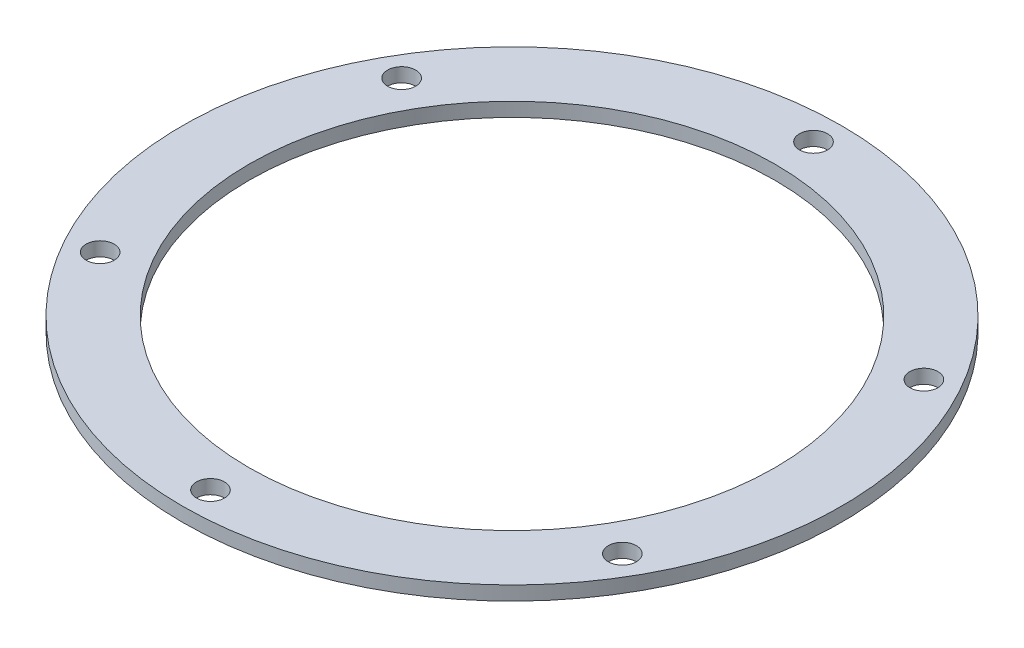
ISO-10303-21;
HEADER;
FILE_DESCRIPTION(('STEP AP214'),'2;1');
FILE_NAME('part.step','',(''),(''),'','','');
FILE_SCHEMA(('AUTOMOTIVE_DESIGN { 1 0 10303 214 1 1 1 1 }'));
ENDSEC;
DATA;
#1=APPLICATION_CONTEXT('core data for automotive mechanical design processes');
#2=APPLICATION_PROTOCOL_DEFINITION('international standard','automotive_design',2000,#1);
#3=PRODUCT_CONTEXT('',#1,'mechanical');
#4=PRODUCT('Part','Part','',(#3));
#5=PRODUCT_RELATED_PRODUCT_CATEGORY('part','',(#4));
#6=PRODUCT_DEFINITION_FORMATION('','',#4);
#7=PRODUCT_DEFINITION_CONTEXT('part definition',#1,'design');
#8=PRODUCT_DEFINITION('design','',#6,#7);
#9=PRODUCT_DEFINITION_SHAPE('','',#8);
#10=(LENGTH_UNIT() NAMED_UNIT(*) SI_UNIT(.MILLI.,.METRE.));
#11=(NAMED_UNIT(*) PLANE_ANGLE_UNIT() SI_UNIT($,.RADIAN.));
#12=(NAMED_UNIT(*) SI_UNIT($,.STERADIAN.) SOLID_ANGLE_UNIT());
#13=UNCERTAINTY_MEASURE_WITH_UNIT(LENGTH_MEASURE(1.E-05),#10,'distance_accuracy_value','');
#14=(GEOMETRIC_REPRESENTATION_CONTEXT(3) GLOBAL_UNCERTAINTY_ASSIGNED_CONTEXT((#13)) GLOBAL_UNIT_ASSIGNED_CONTEXT((#10,
#11,#12)) REPRESENTATION_CONTEXT('',''));
#15=CARTESIAN_POINT('',(0.,0.,0.));
#16=DIRECTION('',(0.,0.,1.));
#17=DIRECTION('',(1.,0.,0.));
#18=AXIS2_PLACEMENT_3D('',#15,#16,#17);
#19=CARTESIAN_POINT('',(0.,2.,0.));
#20=DIRECTION('',(0.,1.,0.));
#21=DIRECTION('',(0.,0.,1.));
#22=AXIS2_PLACEMENT_3D('',#19,#20,#21);
#23=PLANE('',#22);
#24=CARTESIAN_POINT('',(-37.2390923627309,2.,21.5));
#25=DIRECTION('',(0.,1.,0.));
#26=DIRECTION('',(0.,0.,1.));
#27=AXIS2_PLACEMENT_3D('',#24,#25,#26);
#28=CIRCLE('',#27,2.);
#29=CARTESIAN_POINT('',(-37.2390923627309,2.,23.5));
#30=VERTEX_POINT('',#29);
#31=EDGE_CURVE('E79',#30,#30,#28,.T.);
#32=ORIENTED_EDGE('',*,*,#31,.F.);
#33=EDGE_LOOP('',(#32));
#34=FACE_BOUND('',#33,.T.);
#35=CARTESIAN_POINT('',(37.2390923627309,2.,21.5));
#36=DIRECTION('',(0.,1.,0.));
#37=DIRECTION('',(0.,0.,1.));
#38=AXIS2_PLACEMENT_3D('',#35,#36,#37);
#39=CIRCLE('',#38,2.);
#40=CARTESIAN_POINT('',(37.2390923627309,2.,23.5));
#41=VERTEX_POINT('',#40);
#42=EDGE_CURVE('E67',#41,#41,#39,.T.);
#43=ORIENTED_EDGE('',*,*,#42,.F.);
#44=EDGE_LOOP('',(#43));
#45=FACE_BOUND('',#44,.T.);
#46=CARTESIAN_POINT('',(0.,2.,-43.));
#47=DIRECTION('',(0.,1.,0.));
#48=DIRECTION('',(0.,0.,1.));
#49=AXIS2_PLACEMENT_3D('',#46,#47,#48);
#50=CIRCLE('',#49,2.);
#51=CARTESIAN_POINT('',(0.,2.,-41.));
#52=VERTEX_POINT('',#51);
#53=EDGE_CURVE('E55',#52,#52,#50,.T.);
#54=ORIENTED_EDGE('',*,*,#53,.F.);
#55=EDGE_LOOP('',(#54));
#56=FACE_BOUND('',#55,.T.);
#57=CARTESIAN_POINT('',(0.,2.,0.));
#58=DIRECTION('',(0.,1.,0.));
#59=DIRECTION('',(0.,0.,1.));
#60=AXIS2_PLACEMENT_3D('',#57,#58,#59);
#61=CIRCLE('',#60,47.);
#62=CARTESIAN_POINT('',(0.,2.,47.));
#63=VERTEX_POINT('',#62);
#64=EDGE_CURVE('E10',#63,#63,#61,.T.);
#65=ORIENTED_EDGE('',*,*,#64,.T.);
#66=EDGE_LOOP('',(#65));
#67=FACE_BOUND('',#66,.T.);
#68=CARTESIAN_POINT('',(0.,2.,0.));
#69=DIRECTION('',(0.,1.,0.));
#70=DIRECTION('',(0.,0.,1.));
#71=AXIS2_PLACEMENT_3D('',#68,#69,#70);
#72=CIRCLE('',#71,37.5);
#73=CARTESIAN_POINT('',(0.,2.,37.5));
#74=VERTEX_POINT('',#73);
#75=EDGE_CURVE('E50',#74,#74,#72,.T.);
#76=ORIENTED_EDGE('',*,*,#75,.F.);
#77=EDGE_LOOP('',(#76));
#78=FACE_BOUND('',#77,.T.);
#79=CARTESIAN_POINT('',(37.2390923627309,2.,-21.5));
#80=DIRECTION('',(0.,1.,0.));
#81=DIRECTION('',(0.,0.,1.));
#82=AXIS2_PLACEMENT_3D('',#79,#80,#81);
#83=CIRCLE('',#82,2.);
#84=CARTESIAN_POINT('',(37.2390923627309,2.,-19.5));
#85=VERTEX_POINT('',#84);
#86=EDGE_CURVE('E61',#85,#85,#83,.T.);
#87=ORIENTED_EDGE('',*,*,#86,.F.);
#88=EDGE_LOOP('',(#87));
#89=FACE_BOUND('',#88,.T.);
#90=CARTESIAN_POINT('',(0.,2.,43.));
#91=DIRECTION('',(0.,1.,0.));
#92=DIRECTION('',(0.,0.,1.));
#93=AXIS2_PLACEMENT_3D('',#90,#91,#92);
#94=CIRCLE('',#93,2.00000000000001);
#95=CARTESIAN_POINT('',(0.,2.,45.));
#96=VERTEX_POINT('',#95);
#97=EDGE_CURVE('E73',#96,#96,#94,.T.);
#98=ORIENTED_EDGE('',*,*,#97,.F.);
#99=EDGE_LOOP('',(#98));
#100=FACE_BOUND('',#99,.T.);
#101=CARTESIAN_POINT('',(-37.2390923627309,2.,-21.5));
#102=DIRECTION('',(0.,1.,0.));
#103=DIRECTION('',(0.,0.,1.));
#104=AXIS2_PLACEMENT_3D('',#101,#102,#103);
#105=CIRCLE('',#104,2.);
#106=CARTESIAN_POINT('',(-37.2390923627309,2.,-19.5));
#107=VERTEX_POINT('',#106);
#108=EDGE_CURVE('E85',#107,#107,#105,.T.);
#109=ORIENTED_EDGE('',*,*,#108,.F.);
#110=EDGE_LOOP('',(#109));
#111=FACE_BOUND('',#110,.T.);
#112=ADVANCED_FACE('F39',(#34,#45,#56,#67,#78,#89,#100,#111),#23,.T.);
#113=CARTESIAN_POINT('',(0.,0.,0.));
#114=DIRECTION('',(0.,1.,0.));
#115=DIRECTION('',(0.,0.,1.));
#116=AXIS2_PLACEMENT_3D('',#113,#114,#115);
#117=PLANE('',#116);
#118=CARTESIAN_POINT('',(0.,0.,0.));
#119=DIRECTION('',(0.,1.,0.));
#120=DIRECTION('',(0.,0.,1.));
#121=AXIS2_PLACEMENT_3D('',#118,#119,#120);
#122=CIRCLE('',#121,47.);
#123=CARTESIAN_POINT('',(0.,0.,47.));
#124=VERTEX_POINT('',#123);
#125=EDGE_CURVE('E43',#124,#124,#122,.T.);
#126=ORIENTED_EDGE('',*,*,#125,.F.);
#127=EDGE_LOOP('',(#126));
#128=FACE_BOUND('',#127,.T.);
#129=CARTESIAN_POINT('',(0.,0.,0.));
#130=DIRECTION('',(0.,1.,0.));
#131=DIRECTION('',(0.,0.,1.));
#132=AXIS2_PLACEMENT_3D('',#129,#130,#131);
#133=CIRCLE('',#132,37.5);
#134=CARTESIAN_POINT('',(0.,0.,37.5));
#135=VERTEX_POINT('',#134);
#136=EDGE_CURVE('E52',#135,#135,#133,.T.);
#137=ORIENTED_EDGE('',*,*,#136,.T.);
#138=EDGE_LOOP('',(#137));
#139=FACE_BOUND('',#138,.T.);
#140=CARTESIAN_POINT('',(0.,0.,-43.));
#141=DIRECTION('',(0.,1.,0.));
#142=DIRECTION('',(0.,0.,1.));
#143=AXIS2_PLACEMENT_3D('',#140,#141,#142);
#144=CIRCLE('',#143,2.);
#145=CARTESIAN_POINT('',(0.,0.,-41.));
#146=VERTEX_POINT('',#145);
#147=EDGE_CURVE('E58',#146,#146,#144,.T.);
#148=ORIENTED_EDGE('',*,*,#147,.T.);
#149=EDGE_LOOP('',(#148));
#150=FACE_BOUND('',#149,.T.);
#151=CARTESIAN_POINT('',(37.2390923627309,0.,-21.5));
#152=DIRECTION('',(0.,1.,0.));
#153=DIRECTION('',(0.,0.,1.));
#154=AXIS2_PLACEMENT_3D('',#151,#152,#153);
#155=CIRCLE('',#154,2.);
#156=CARTESIAN_POINT('',(37.2390923627309,0.,-19.5));
#157=VERTEX_POINT('',#156);
#158=EDGE_CURVE('E64',#157,#157,#155,.T.);
#159=ORIENTED_EDGE('',*,*,#158,.T.);
#160=EDGE_LOOP('',(#159));
#161=FACE_BOUND('',#160,.T.);
#162=CARTESIAN_POINT('',(37.2390923627309,0.,21.5));
#163=DIRECTION('',(0.,1.,0.));
#164=DIRECTION('',(0.,0.,1.));
#165=AXIS2_PLACEMENT_3D('',#162,#163,#164);
#166=CIRCLE('',#165,2.);
#167=CARTESIAN_POINT('',(37.2390923627309,0.,23.5));
#168=VERTEX_POINT('',#167);
#169=EDGE_CURVE('E70',#168,#168,#166,.T.);
#170=ORIENTED_EDGE('',*,*,#169,.T.);
#171=EDGE_LOOP('',(#170));
#172=FACE_BOUND('',#171,.T.);
#173=CARTESIAN_POINT('',(0.,0.,43.));
#174=DIRECTION('',(0.,1.,0.));
#175=DIRECTION('',(0.,0.,1.));
#176=AXIS2_PLACEMENT_3D('',#173,#174,#175);
#177=CIRCLE('',#176,2.00000000000001);
#178=CARTESIAN_POINT('',(0.,0.,45.));
#179=VERTEX_POINT('',#178);
#180=EDGE_CURVE('E76',#179,#179,#177,.T.);
#181=ORIENTED_EDGE('',*,*,#180,.T.);
#182=EDGE_LOOP('',(#181));
#183=FACE_BOUND('',#182,.T.);
#184=CARTESIAN_POINT('',(-37.2390923627309,0.,21.5));
#185=DIRECTION('',(0.,1.,0.));
#186=DIRECTION('',(0.,0.,1.));
#187=AXIS2_PLACEMENT_3D('',#184,#185,#186);
#188=CIRCLE('',#187,2.);
#189=CARTESIAN_POINT('',(-37.2390923627309,0.,23.5));
#190=VERTEX_POINT('',#189);
#191=EDGE_CURVE('E82',#190,#190,#188,.T.);
#192=ORIENTED_EDGE('',*,*,#191,.T.);
#193=EDGE_LOOP('',(#192));
#194=FACE_BOUND('',#193,.T.);
#195=CARTESIAN_POINT('',(-37.2390923627309,0.,-21.5));
#196=DIRECTION('',(0.,1.,0.));
#197=DIRECTION('',(0.,0.,1.));
#198=AXIS2_PLACEMENT_3D('',#195,#196,#197);
#199=CIRCLE('',#198,2.);
#200=CARTESIAN_POINT('',(-37.2390923627309,0.,-19.5));
#201=VERTEX_POINT('',#200);
#202=EDGE_CURVE('E88',#201,#201,#199,.T.);
#203=ORIENTED_EDGE('',*,*,#202,.T.);
#204=EDGE_LOOP('',(#203));
#205=FACE_BOUND('',#204,.T.);
#206=ADVANCED_FACE('F98',(#128,#139,#150,#161,#172,#183,#194,#205),#117,.F.);
#207=CARTESIAN_POINT('',(0.,2.,0.));
#208=DIRECTION('',(0.,-1.,0.));
#209=DIRECTION('',(0.,0.,-1.));
#210=AXIS2_PLACEMENT_3D('',#207,#208,#209);
#211=CYLINDRICAL_SURFACE('',#210,47.);
#212=ORIENTED_EDGE('',*,*,#64,.F.);
#213=EDGE_LOOP('',(#212));
#214=FACE_BOUND('',#213,.T.);
#215=ORIENTED_EDGE('',*,*,#125,.T.);
#216=EDGE_LOOP('',(#215));
#217=FACE_BOUND('',#216,.T.);
#218=ADVANCED_FACE('F41',(#214,#217),#211,.T.);
#219=CARTESIAN_POINT('',(0.,2.,0.));
#220=DIRECTION('',(0.,-1.,0.));
#221=DIRECTION('',(0.,0.,-1.));
#222=AXIS2_PLACEMENT_3D('',#219,#220,#221);
#223=CYLINDRICAL_SURFACE('',#222,37.5);
#224=ORIENTED_EDGE('',*,*,#75,.T.);
#225=EDGE_LOOP('',(#224));
#226=FACE_BOUND('',#225,.T.);
#227=ORIENTED_EDGE('',*,*,#136,.F.);
#228=EDGE_LOOP('',(#227));
#229=FACE_BOUND('',#228,.T.);
#230=ADVANCED_FACE('F108',(#226,#229),#223,.F.);
#231=CARTESIAN_POINT('',(0.,2.,-43.));
#232=DIRECTION('',(0.,-1.,0.));
#233=DIRECTION('',(0.,0.,-1.));
#234=AXIS2_PLACEMENT_3D('',#231,#232,#233);
#235=CYLINDRICAL_SURFACE('',#234,2.);
#236=ORIENTED_EDGE('',*,*,#53,.T.);
#237=EDGE_LOOP('',(#236));
#238=FACE_BOUND('',#237,.T.);
#239=ORIENTED_EDGE('',*,*,#147,.F.);
#240=EDGE_LOOP('',(#239));
#241=FACE_BOUND('',#240,.T.);
#242=ADVANCED_FACE('F111',(#238,#241),#235,.F.);
#243=CARTESIAN_POINT('',(37.2390923627309,2.,-21.5));
#244=DIRECTION('',(0.,-1.,0.));
#245=DIRECTION('',(0.,0.,-1.));
#246=AXIS2_PLACEMENT_3D('',#243,#244,#245);
#247=CYLINDRICAL_SURFACE('',#246,2.);
#248=ORIENTED_EDGE('',*,*,#86,.T.);
#249=EDGE_LOOP('',(#248));
#250=FACE_BOUND('',#249,.T.);
#251=ORIENTED_EDGE('',*,*,#158,.F.);
#252=EDGE_LOOP('',(#251));
#253=FACE_BOUND('',#252,.T.);
#254=ADVANCED_FACE('F115',(#250,#253),#247,.F.);
#255=CARTESIAN_POINT('',(37.2390923627309,2.,21.5));
#256=DIRECTION('',(0.,-1.,0.));
#257=DIRECTION('',(0.,0.,-1.));
#258=AXIS2_PLACEMENT_3D('',#255,#256,#257);
#259=CYLINDRICAL_SURFACE('',#258,2.);
#260=ORIENTED_EDGE('',*,*,#42,.T.);
#261=EDGE_LOOP('',(#260));
#262=FACE_BOUND('',#261,.T.);
#263=ORIENTED_EDGE('',*,*,#169,.F.);
#264=EDGE_LOOP('',(#263));
#265=FACE_BOUND('',#264,.T.);
#266=ADVANCED_FACE('F119',(#262,#265),#259,.F.);
#267=CARTESIAN_POINT('',(0.,2.,43.));
#268=DIRECTION('',(0.,-1.,0.));
#269=DIRECTION('',(0.,0.,-1.));
#270=AXIS2_PLACEMENT_3D('',#267,#268,#269);
#271=CYLINDRICAL_SURFACE('',#270,2.00000000000001);
#272=ORIENTED_EDGE('',*,*,#97,.T.);
#273=EDGE_LOOP('',(#272));
#274=FACE_BOUND('',#273,.T.);
#275=ORIENTED_EDGE('',*,*,#180,.F.);
#276=EDGE_LOOP('',(#275));
#277=FACE_BOUND('',#276,.T.);
#278=ADVANCED_FACE('F123',(#274,#277),#271,.F.);
#279=CARTESIAN_POINT('',(-37.2390923627309,2.,21.5));
#280=DIRECTION('',(0.,-1.,0.));
#281=DIRECTION('',(0.,0.,-1.));
#282=AXIS2_PLACEMENT_3D('',#279,#280,#281);
#283=CYLINDRICAL_SURFACE('',#282,2.);
#284=ORIENTED_EDGE('',*,*,#31,.T.);
#285=EDGE_LOOP('',(#284));
#286=FACE_BOUND('',#285,.T.);
#287=ORIENTED_EDGE('',*,*,#191,.F.);
#288=EDGE_LOOP('',(#287));
#289=FACE_BOUND('',#288,.T.);
#290=ADVANCED_FACE('F127',(#286,#289),#283,.F.);
#291=CARTESIAN_POINT('',(-37.2390923627309,2.,-21.5));
#292=DIRECTION('',(0.,-1.,0.));
#293=DIRECTION('',(0.,0.,-1.));
#294=AXIS2_PLACEMENT_3D('',#291,#292,#293);
#295=CYLINDRICAL_SURFACE('',#294,2.);
#296=ORIENTED_EDGE('',*,*,#108,.T.);
#297=EDGE_LOOP('',(#296));
#298=FACE_BOUND('',#297,.T.);
#299=ORIENTED_EDGE('',*,*,#202,.F.);
#300=EDGE_LOOP('',(#299));
#301=FACE_BOUND('',#300,.T.);
#302=ADVANCED_FACE('F94',(#298,#301),#295,.F.);
#303=CLOSED_SHELL('',(#112,#206,#218,#230,#242,#254,#266,#278,#290,#302));
#304=MANIFOLD_SOLID_BREP('B2',#303);
#305=ADVANCED_BREP_SHAPE_REPRESENTATION('',(#18,#304),#14);
#306=SHAPE_DEFINITION_REPRESENTATION(#9,#305);
ENDSEC;
END-ISO-10303-21;
